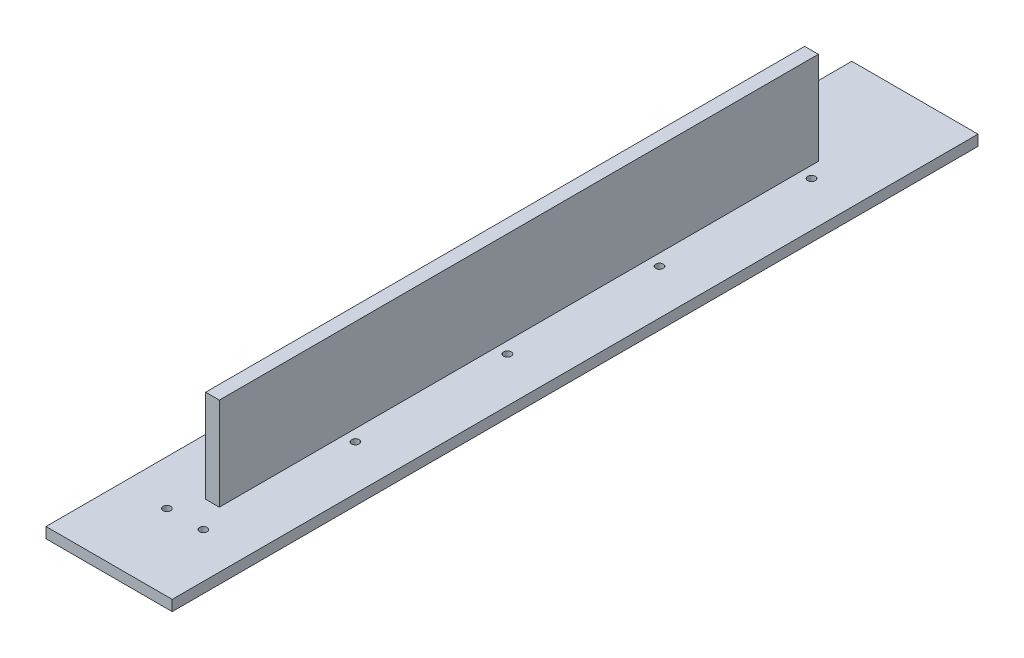
ISO-10303-21;
HEADER;
FILE_DESCRIPTION(('STEP AP214'),'2;1');
FILE_NAME('part.step','',(''),(''),'','','');
FILE_SCHEMA(('AUTOMOTIVE_DESIGN { 1 0 10303 214 1 1 1 1 }'));
ENDSEC;
DATA;
#1=APPLICATION_CONTEXT('core data for automotive mechanical design processes');
#2=APPLICATION_PROTOCOL_DEFINITION('international standard','automotive_design',2000,#1);
#3=PRODUCT_CONTEXT('',#1,'mechanical');
#4=PRODUCT('Part','Part','',(#3));
#5=PRODUCT_RELATED_PRODUCT_CATEGORY('part','',(#4));
#6=PRODUCT_DEFINITION_FORMATION('','',#4);
#7=PRODUCT_DEFINITION_CONTEXT('part definition',#1,'design');
#8=PRODUCT_DEFINITION('design','',#6,#7);
#9=PRODUCT_DEFINITION_SHAPE('','',#8);
#10=(LENGTH_UNIT() NAMED_UNIT(*) SI_UNIT(.MILLI.,.METRE.));
#11=(NAMED_UNIT(*) PLANE_ANGLE_UNIT() SI_UNIT($,.RADIAN.));
#12=(NAMED_UNIT(*) SI_UNIT($,.STERADIAN.) SOLID_ANGLE_UNIT());
#13=UNCERTAINTY_MEASURE_WITH_UNIT(LENGTH_MEASURE(1.E-05),#10,'distance_accuracy_value','');
#14=(GEOMETRIC_REPRESENTATION_CONTEXT(3) GLOBAL_UNCERTAINTY_ASSIGNED_CONTEXT((#13)) GLOBAL_UNIT_ASSIGNED_CONTEXT((#10,
#11,#12)) REPRESENTATION_CONTEXT('',''));
#15=CARTESIAN_POINT('',(0.,0.,0.));
#16=DIRECTION('',(0.,0.,1.));
#17=DIRECTION('',(1.,0.,0.));
#18=AXIS2_PLACEMENT_3D('',#15,#16,#17);
#19=CARTESIAN_POINT('',(0.,7.,530.));
#20=DIRECTION('',(1.,0.,0.));
#21=DIRECTION('',(0.,0.,-1.));
#22=AXIS2_PLACEMENT_3D('',#19,#20,#21);
#23=PLANE('',#22);
#24=DIRECTION('',(0.,-1.,0.));
#25=VECTOR('',#24,1.);
#26=CARTESIAN_POINT('',(0.,7.,0.));
#27=LINE('',#26,#25);
#28=CARTESIAN_POINT('',(0.,7.,0.));
#29=VERTEX_POINT('',#28);
#30=CARTESIAN_POINT('',(0.,0.,0.));
#31=VERTEX_POINT('',#30);
#32=EDGE_CURVE('E149',#29,#31,#27,.T.);
#33=ORIENTED_EDGE('',*,*,#32,.T.);
#34=DIRECTION('',(0.,0.,-1.));
#35=VECTOR('',#34,1.);
#36=CARTESIAN_POINT('',(0.,0.,530.));
#37=LINE('',#36,#35);
#38=CARTESIAN_POINT('',(0.,0.,530.));
#39=VERTEX_POINT('',#38);
#40=EDGE_CURVE('E11',#39,#31,#37,.T.);
#41=ORIENTED_EDGE('',*,*,#40,.F.);
#42=DIRECTION('',(0.,-1.,0.));
#43=VECTOR('',#42,1.);
#44=CARTESIAN_POINT('',(0.,7.,530.));
#45=LINE('',#44,#43);
#46=CARTESIAN_POINT('',(0.,7.,530.));
#47=VERTEX_POINT('',#46);
#48=EDGE_CURVE('E147',#47,#39,#45,.T.);
#49=ORIENTED_EDGE('',*,*,#48,.F.);
#50=DIRECTION('',(0.,0.,-1.));
#51=VECTOR('',#50,1.);
#52=CARTESIAN_POINT('',(0.,7.,530.));
#53=LINE('',#52,#51);
#54=EDGE_CURVE('E153',#47,#29,#53,.T.);
#55=ORIENTED_EDGE('',*,*,#54,.T.);
#56=EDGE_LOOP('',(#33,#41,#49,#55));
#57=FACE_BOUND('',#56,.T.);
#58=ADVANCED_FACE('F34',(#57),#23,.F.);
#59=CARTESIAN_POINT('',(0.,0.,530.));
#60=DIRECTION('',(0.,1.,0.));
#61=DIRECTION('',(0.,0.,1.));
#62=AXIS2_PLACEMENT_3D('',#59,#60,#61);
#63=PLANE('',#62);
#64=CARTESIAN_POINT('',(53.4999999999999,0.,480.));
#65=DIRECTION('',(0.,-1.,0.));
#66=DIRECTION('',(0.,0.,1.));
#67=AXIS2_PLACEMENT_3D('',#64,#65,#66);
#68=CIRCLE('',#67,2.5);
#69=CARTESIAN_POINT('',(53.4999999999999,0.,482.5));
#70=VERTEX_POINT('',#69);
#71=EDGE_CURVE('E368',#70,#70,#68,.T.);
#72=ORIENTED_EDGE('',*,*,#71,.F.);
#73=EDGE_LOOP('',(#72));
#74=FACE_BOUND('',#73,.T.);
#75=CARTESIAN_POINT('',(29.4999999999999,0.,480.));
#76=DIRECTION('',(0.,-1.,0.));
#77=DIRECTION('',(0.,0.,-1.));
#78=AXIS2_PLACEMENT_3D('',#75,#76,#77);
#79=CIRCLE('',#78,2.50000000000001);
#80=CARTESIAN_POINT('',(29.4999999999999,0.,477.5));
#81=VERTEX_POINT('',#80);
#82=EDGE_CURVE('E370',#81,#81,#79,.T.);
#83=ORIENTED_EDGE('',*,*,#82,.F.);
#84=EDGE_LOOP('',(#83));
#85=FACE_BOUND('',#84,.T.);
#86=CARTESIAN_POINT('',(53.4999999999999,0.,380.));
#87=DIRECTION('',(0.,-1.,0.));
#88=DIRECTION('',(0.,0.,1.));
#89=AXIS2_PLACEMENT_3D('',#86,#87,#88);
#90=CIRCLE('',#89,2.5);
#91=CARTESIAN_POINT('',(53.4999999999999,0.,382.5));
#92=VERTEX_POINT('',#91);
#93=EDGE_CURVE('E376',#92,#92,#90,.T.);
#94=ORIENTED_EDGE('',*,*,#93,.F.);
#95=EDGE_LOOP('',(#94));
#96=FACE_BOUND('',#95,.T.);
#97=CARTESIAN_POINT('',(29.4999999999999,0.,380.));
#98=DIRECTION('',(0.,-1.,0.));
#99=DIRECTION('',(0.,0.,-1.));
#100=AXIS2_PLACEMENT_3D('',#97,#98,#99);
#101=CIRCLE('',#100,2.5);
#102=CARTESIAN_POINT('',(29.4999999999999,0.,377.5));
#103=VERTEX_POINT('',#102);
#104=EDGE_CURVE('E382',#103,#103,#101,.T.);
#105=ORIENTED_EDGE('',*,*,#104,.F.);
#106=EDGE_LOOP('',(#105));
#107=FACE_BOUND('',#106,.T.);
#108=CARTESIAN_POINT('',(53.5,0.,280.));
#109=DIRECTION('',(0.,-1.,0.));
#110=DIRECTION('',(0.,0.,1.));
#111=AXIS2_PLACEMENT_3D('',#108,#109,#110);
#112=CIRCLE('',#111,2.5);
#113=CARTESIAN_POINT('',(53.5,0.,282.5));
#114=VERTEX_POINT('',#113);
#115=EDGE_CURVE('E388',#114,#114,#112,.T.);
#116=ORIENTED_EDGE('',*,*,#115,.F.);
#117=EDGE_LOOP('',(#116));
#118=FACE_BOUND('',#117,.T.);
#119=CARTESIAN_POINT('',(29.5,0.,280.));
#120=DIRECTION('',(0.,-1.,0.));
#121=DIRECTION('',(0.,0.,-1.));
#122=AXIS2_PLACEMENT_3D('',#119,#120,#121);
#123=CIRCLE('',#122,2.50000000000001);
#124=CARTESIAN_POINT('',(29.5,0.,277.5));
#125=VERTEX_POINT('',#124);
#126=EDGE_CURVE('E394',#125,#125,#123,.T.);
#127=ORIENTED_EDGE('',*,*,#126,.F.);
#128=EDGE_LOOP('',(#127));
#129=FACE_BOUND('',#128,.T.);
#130=CARTESIAN_POINT('',(53.5,0.,180.));
#131=DIRECTION('',(0.,-1.,0.));
#132=DIRECTION('',(0.,0.,1.));
#133=AXIS2_PLACEMENT_3D('',#130,#131,#132);
#134=CIRCLE('',#133,2.5);
#135=CARTESIAN_POINT('',(53.5,0.,182.5));
#136=VERTEX_POINT('',#135);
#137=EDGE_CURVE('E400',#136,#136,#134,.T.);
#138=ORIENTED_EDGE('',*,*,#137,.F.);
#139=EDGE_LOOP('',(#138));
#140=FACE_BOUND('',#139,.T.);
#141=CARTESIAN_POINT('',(29.5,0.,180.));
#142=DIRECTION('',(0.,-1.,0.));
#143=DIRECTION('',(0.,0.,-1.));
#144=AXIS2_PLACEMENT_3D('',#141,#142,#143);
#145=CIRCLE('',#144,2.50000000000001);
#146=CARTESIAN_POINT('',(29.5,0.,177.5));
#147=VERTEX_POINT('',#146);
#148=EDGE_CURVE('E406',#147,#147,#145,.T.);
#149=ORIENTED_EDGE('',*,*,#148,.F.);
#150=EDGE_LOOP('',(#149));
#151=FACE_BOUND('',#150,.T.);
#152=CARTESIAN_POINT('',(53.5,0.,80.));
#153=DIRECTION('',(0.,-1.,0.));
#154=DIRECTION('',(0.,0.,1.));
#155=AXIS2_PLACEMENT_3D('',#152,#153,#154);
#156=CIRCLE('',#155,2.5);
#157=CARTESIAN_POINT('',(53.5,0.,82.5));
#158=VERTEX_POINT('',#157);
#159=EDGE_CURVE('E412',#158,#158,#156,.T.);
#160=ORIENTED_EDGE('',*,*,#159,.F.);
#161=EDGE_LOOP('',(#160));
#162=FACE_BOUND('',#161,.T.);
#163=CARTESIAN_POINT('',(29.5,0.,80.));
#164=DIRECTION('',(0.,-1.,0.));
#165=DIRECTION('',(0.,0.,-1.));
#166=AXIS2_PLACEMENT_3D('',#163,#164,#165);
#167=CIRCLE('',#166,2.50000000000001);
#168=CARTESIAN_POINT('',(29.5,0.,77.5));
#169=VERTEX_POINT('',#168);
#170=EDGE_CURVE('E418',#169,#169,#167,.T.);
#171=ORIENTED_EDGE('',*,*,#170,.F.);
#172=EDGE_LOOP('',(#171));
#173=FACE_BOUND('',#172,.T.);
#174=DIRECTION('',(1.,0.,0.));
#175=VECTOR('',#174,1.);
#176=CARTESIAN_POINT('',(0.,0.,0.));
#177=LINE('',#176,#175);
#178=CARTESIAN_POINT('',(83.,0.,0.));
#179=VERTEX_POINT('',#178);
#180=EDGE_CURVE('E145',#31,#179,#177,.T.);
#181=ORIENTED_EDGE('',*,*,#180,.T.);
#182=DIRECTION('',(0.,0.,-1.));
#183=VECTOR('',#182,1.);
#184=CARTESIAN_POINT('',(83.,0.,530.));
#185=LINE('',#184,#183);
#186=CARTESIAN_POINT('',(83.,0.,530.));
#187=VERTEX_POINT('',#186);
#188=EDGE_CURVE('E42',#187,#179,#185,.T.);
#189=ORIENTED_EDGE('',*,*,#188,.F.);
#190=DIRECTION('',(1.,0.,0.));
#191=VECTOR('',#190,1.);
#192=CARTESIAN_POINT('',(0.,0.,530.));
#193=LINE('',#192,#191);
#194=EDGE_CURVE('E79',#39,#187,#193,.T.);
#195=ORIENTED_EDGE('',*,*,#194,.F.);
#196=ORIENTED_EDGE('',*,*,#40,.T.);
#197=EDGE_LOOP('',(#181,#189,#195,#196));
#198=FACE_BOUND('',#197,.T.);
#199=ADVANCED_FACE('F195',(#74,#85,#96,#107,#118,#129,#140,#151,#162,#173,#198),#63,.F.);
#200=CARTESIAN_POINT('',(83.,0.,530.));
#201=DIRECTION('',(-1.,0.,0.));
#202=DIRECTION('',(0.,0.,1.));
#203=AXIS2_PLACEMENT_3D('',#200,#201,#202);
#204=PLANE('',#203);
#205=DIRECTION('',(0.,1.,0.));
#206=VECTOR('',#205,1.);
#207=CARTESIAN_POINT('',(83.,0.,0.));
#208=LINE('',#207,#206);
#209=CARTESIAN_POINT('',(83.,7.,0.));
#210=VERTEX_POINT('',#209);
#211=EDGE_CURVE('E142',#179,#210,#208,.T.);
#212=ORIENTED_EDGE('',*,*,#211,.T.);
#213=DIRECTION('',(0.,0.,-1.));
#214=VECTOR('',#213,1.);
#215=CARTESIAN_POINT('',(83.,7.,530.));
#216=LINE('',#215,#214);
#217=CARTESIAN_POINT('',(83.,7.,530.));
#218=VERTEX_POINT('',#217);
#219=EDGE_CURVE('E131',#218,#210,#216,.T.);
#220=ORIENTED_EDGE('',*,*,#219,.F.);
#221=DIRECTION('',(0.,1.,0.));
#222=VECTOR('',#221,1.);
#223=CARTESIAN_POINT('',(83.,0.,530.));
#224=LINE('',#223,#222);
#225=EDGE_CURVE('E143',#187,#218,#224,.T.);
#226=ORIENTED_EDGE('',*,*,#225,.F.);
#227=ORIENTED_EDGE('',*,*,#188,.T.);
#228=EDGE_LOOP('',(#212,#220,#226,#227));
#229=FACE_BOUND('',#228,.T.);
#230=ADVANCED_FACE('F140',(#229),#204,.F.);
#231=CARTESIAN_POINT('',(46.,7.,530.));
#232=DIRECTION('',(-1.,0.,0.));
#233=DIRECTION('',(0.,0.,1.));
#234=AXIS2_PLACEMENT_3D('',#231,#232,#233);
#235=PLANE('',#234);
#236=DIRECTION('',(0.,0.,-1.));
#237=VECTOR('',#236,1.);
#238=CARTESIAN_POINT('',(46.,68.,530.));
#239=LINE('',#238,#237);
#240=CARTESIAN_POINT('',(46.,68.,462.));
#241=VERTEX_POINT('',#240);
#242=CARTESIAN_POINT('',(46.,68.,68.));
#243=VERTEX_POINT('',#242);
#244=EDGE_CURVE('E121',#241,#243,#239,.T.);
#245=ORIENTED_EDGE('',*,*,#244,.F.);
#246=DIRECTION('',(0.,-1.,0.));
#247=VECTOR('',#246,1.);
#248=CARTESIAN_POINT('',(46.,68.,462.));
#249=LINE('',#248,#247);
#250=CARTESIAN_POINT('',(46.,6.99999999999999,462.));
#251=VERTEX_POINT('',#250);
#252=EDGE_CURVE('E105',#241,#251,#249,.T.);
#253=ORIENTED_EDGE('',*,*,#252,.T.);
#254=DIRECTION('',(0.,0.,-1.));
#255=VECTOR('',#254,1.);
#256=CARTESIAN_POINT('',(46.,7.,530.));
#257=LINE('',#256,#255);
#258=CARTESIAN_POINT('',(46.,7.,68.));
#259=VERTEX_POINT('',#258);
#260=EDGE_CURVE('E129',#251,#259,#257,.T.);
#261=ORIENTED_EDGE('',*,*,#260,.T.);
#262=DIRECTION('',(0.,1.,0.));
#263=VECTOR('',#262,1.);
#264=CARTESIAN_POINT('',(46.,68.,68.));
#265=LINE('',#264,#263);
#266=EDGE_CURVE('E128',#259,#243,#265,.T.);
#267=ORIENTED_EDGE('',*,*,#266,.T.);
#268=EDGE_LOOP('',(#245,#253,#261,#267));
#269=FACE_BOUND('',#268,.T.);
#270=ADVANCED_FACE('F126',(#269),#235,.F.);
#271=CARTESIAN_POINT('',(46.,68.,530.));
#272=DIRECTION('',(0.,-1.,0.));
#273=DIRECTION('',(0.,0.,-1.));
#274=AXIS2_PLACEMENT_3D('',#271,#272,#273);
#275=PLANE('',#274);
#276=DIRECTION('',(0.,0.,-1.));
#277=VECTOR('',#276,1.);
#278=CARTESIAN_POINT('',(37.,68.,530.));
#279=LINE('',#278,#277);
#280=CARTESIAN_POINT('',(37.,68.,462.));
#281=VERTEX_POINT('',#280);
#282=CARTESIAN_POINT('',(37.,68.,68.));
#283=VERTEX_POINT('',#282);
#284=EDGE_CURVE('E123',#281,#283,#279,.T.);
#285=ORIENTED_EDGE('',*,*,#284,.F.);
#286=DIRECTION('',(-1.,0.,0.));
#287=VECTOR('',#286,1.);
#288=CARTESIAN_POINT('',(46.,68.,462.));
#289=LINE('',#288,#287);
#290=EDGE_CURVE('E109',#241,#281,#289,.T.);
#291=ORIENTED_EDGE('',*,*,#290,.F.);
#292=ORIENTED_EDGE('',*,*,#244,.T.);
#293=DIRECTION('',(-1.,0.,0.));
#294=VECTOR('',#293,1.);
#295=CARTESIAN_POINT('',(46.,68.,68.));
#296=LINE('',#295,#294);
#297=EDGE_CURVE('E166',#243,#283,#296,.T.);
#298=ORIENTED_EDGE('',*,*,#297,.T.);
#299=EDGE_LOOP('',(#285,#291,#292,#298));
#300=FACE_BOUND('',#299,.T.);
#301=ADVANCED_FACE('F119',(#300),#275,.F.);
#302=CARTESIAN_POINT('',(37.,68.,530.));
#303=DIRECTION('',(1.,0.,0.));
#304=DIRECTION('',(0.,0.,-1.));
#305=AXIS2_PLACEMENT_3D('',#302,#303,#304);
#306=PLANE('',#305);
#307=DIRECTION('',(0.,0.,-1.));
#308=VECTOR('',#307,1.);
#309=CARTESIAN_POINT('',(37.,7.,530.));
#310=LINE('',#309,#308);
#311=CARTESIAN_POINT('',(37.,6.99999999999999,462.));
#312=VERTEX_POINT('',#311);
#313=CARTESIAN_POINT('',(37.,7.,68.));
#314=VERTEX_POINT('',#313);
#315=EDGE_CURVE('E133',#312,#314,#310,.T.);
#316=ORIENTED_EDGE('',*,*,#315,.F.);
#317=DIRECTION('',(0.,-1.,0.));
#318=VECTOR('',#317,1.);
#319=CARTESIAN_POINT('',(37.,68.,462.));
#320=LINE('',#319,#318);
#321=EDGE_CURVE('E115',#281,#312,#320,.T.);
#322=ORIENTED_EDGE('',*,*,#321,.F.);
#323=ORIENTED_EDGE('',*,*,#284,.T.);
#324=DIRECTION('',(0.,1.,0.));
#325=VECTOR('',#324,1.);
#326=CARTESIAN_POINT('',(37.,68.,68.));
#327=LINE('',#326,#325);
#328=EDGE_CURVE('E165',#314,#283,#327,.T.);
#329=ORIENTED_EDGE('',*,*,#328,.F.);
#330=EDGE_LOOP('',(#316,#322,#323,#329));
#331=FACE_BOUND('',#330,.T.);
#332=ADVANCED_FACE('F168',(#331),#306,.F.);
#333=CARTESIAN_POINT('',(37.,7.,530.));
#334=DIRECTION('',(0.,-1.,0.));
#335=DIRECTION('',(1.,0.,0.));
#336=AXIS2_PLACEMENT_3D('',#333,#334,#335);
#337=PLANE('',#336);
#338=CARTESIAN_POINT('',(53.4999999999999,7.,480.));
#339=DIRECTION('',(0.,-1.,0.));
#340=DIRECTION('',(0.,0.,1.));
#341=AXIS2_PLACEMENT_3D('',#338,#339,#340);
#342=CIRCLE('',#341,2.5);
#343=CARTESIAN_POINT('',(53.4999999999999,7.,482.5));
#344=VERTEX_POINT('',#343);
#345=EDGE_CURVE('E366',#344,#344,#342,.T.);
#346=ORIENTED_EDGE('',*,*,#345,.T.);
#347=EDGE_LOOP('',(#346));
#348=FACE_BOUND('',#347,.T.);
#349=CARTESIAN_POINT('',(29.4999999999999,7.,480.));
#350=DIRECTION('',(0.,-1.,0.));
#351=DIRECTION('',(0.,0.,-1.));
#352=AXIS2_PLACEMENT_3D('',#349,#350,#351);
#353=CIRCLE('',#352,2.50000000000001);
#354=CARTESIAN_POINT('',(29.4999999999999,7.,477.5));
#355=VERTEX_POINT('',#354);
#356=EDGE_CURVE('E373',#355,#355,#353,.T.);
#357=ORIENTED_EDGE('',*,*,#356,.T.);
#358=EDGE_LOOP('',(#357));
#359=FACE_BOUND('',#358,.T.);
#360=CARTESIAN_POINT('',(53.4999999999999,7.,380.));
#361=DIRECTION('',(0.,-1.,0.));
#362=DIRECTION('',(0.,0.,1.));
#363=AXIS2_PLACEMENT_3D('',#360,#361,#362);
#364=CIRCLE('',#363,2.5);
#365=CARTESIAN_POINT('',(53.4999999999999,7.,382.5));
#366=VERTEX_POINT('',#365);
#367=EDGE_CURVE('E379',#366,#366,#364,.T.);
#368=ORIENTED_EDGE('',*,*,#367,.T.);
#369=EDGE_LOOP('',(#368));
#370=FACE_BOUND('',#369,.T.);
#371=CARTESIAN_POINT('',(29.4999999999999,7.,380.));
#372=DIRECTION('',(0.,-1.,0.));
#373=DIRECTION('',(0.,0.,-1.));
#374=AXIS2_PLACEMENT_3D('',#371,#372,#373);
#375=CIRCLE('',#374,2.5);
#376=CARTESIAN_POINT('',(29.4999999999999,7.,377.5));
#377=VERTEX_POINT('',#376);
#378=EDGE_CURVE('E385',#377,#377,#375,.T.);
#379=ORIENTED_EDGE('',*,*,#378,.T.);
#380=EDGE_LOOP('',(#379));
#381=FACE_BOUND('',#380,.T.);
#382=CARTESIAN_POINT('',(53.5,7.,280.));
#383=DIRECTION('',(0.,-1.,0.));
#384=DIRECTION('',(0.,0.,1.));
#385=AXIS2_PLACEMENT_3D('',#382,#383,#384);
#386=CIRCLE('',#385,2.5);
#387=CARTESIAN_POINT('',(53.5,7.,282.5));
#388=VERTEX_POINT('',#387);
#389=EDGE_CURVE('E391',#388,#388,#386,.T.);
#390=ORIENTED_EDGE('',*,*,#389,.T.);
#391=EDGE_LOOP('',(#390));
#392=FACE_BOUND('',#391,.T.);
#393=CARTESIAN_POINT('',(29.5,7.,280.));
#394=DIRECTION('',(0.,-1.,0.));
#395=DIRECTION('',(0.,0.,-1.));
#396=AXIS2_PLACEMENT_3D('',#393,#394,#395);
#397=CIRCLE('',#396,2.50000000000001);
#398=CARTESIAN_POINT('',(29.5,7.,277.5));
#399=VERTEX_POINT('',#398);
#400=EDGE_CURVE('E397',#399,#399,#397,.T.);
#401=ORIENTED_EDGE('',*,*,#400,.T.);
#402=EDGE_LOOP('',(#401));
#403=FACE_BOUND('',#402,.T.);
#404=CARTESIAN_POINT('',(53.5,7.,180.));
#405=DIRECTION('',(0.,-1.,0.));
#406=DIRECTION('',(0.,0.,1.));
#407=AXIS2_PLACEMENT_3D('',#404,#405,#406);
#408=CIRCLE('',#407,2.5);
#409=CARTESIAN_POINT('',(53.5,7.,182.5));
#410=VERTEX_POINT('',#409);
#411=EDGE_CURVE('E403',#410,#410,#408,.T.);
#412=ORIENTED_EDGE('',*,*,#411,.T.);
#413=EDGE_LOOP('',(#412));
#414=FACE_BOUND('',#413,.T.);
#415=CARTESIAN_POINT('',(29.5,7.,180.));
#416=DIRECTION('',(0.,-1.,0.));
#417=DIRECTION('',(0.,0.,-1.));
#418=AXIS2_PLACEMENT_3D('',#415,#416,#417);
#419=CIRCLE('',#418,2.50000000000001);
#420=CARTESIAN_POINT('',(29.5,7.,177.5));
#421=VERTEX_POINT('',#420);
#422=EDGE_CURVE('E409',#421,#421,#419,.T.);
#423=ORIENTED_EDGE('',*,*,#422,.T.);
#424=EDGE_LOOP('',(#423));
#425=FACE_BOUND('',#424,.T.);
#426=CARTESIAN_POINT('',(53.5,7.,80.));
#427=DIRECTION('',(0.,-1.,0.));
#428=DIRECTION('',(0.,0.,1.));
#429=AXIS2_PLACEMENT_3D('',#426,#427,#428);
#430=CIRCLE('',#429,2.5);
#431=CARTESIAN_POINT('',(53.5,7.,82.5));
#432=VERTEX_POINT('',#431);
#433=EDGE_CURVE('E415',#432,#432,#430,.T.);
#434=ORIENTED_EDGE('',*,*,#433,.T.);
#435=EDGE_LOOP('',(#434));
#436=FACE_BOUND('',#435,.T.);
#437=CARTESIAN_POINT('',(29.5,7.,80.));
#438=DIRECTION('',(0.,-1.,0.));
#439=DIRECTION('',(0.,0.,-1.));
#440=AXIS2_PLACEMENT_3D('',#437,#438,#439);
#441=CIRCLE('',#440,2.50000000000001);
#442=CARTESIAN_POINT('',(29.5,7.,77.5));
#443=VERTEX_POINT('',#442);
#444=EDGE_CURVE('E421',#443,#443,#441,.T.);
#445=ORIENTED_EDGE('',*,*,#444,.T.);
#446=EDGE_LOOP('',(#445));
#447=FACE_BOUND('',#446,.T.);
#448=ORIENTED_EDGE('',*,*,#260,.F.);
#449=DIRECTION('',(-1.,0.,0.));
#450=VECTOR('',#449,1.);
#451=CARTESIAN_POINT('',(46.,6.99999999999999,462.));
#452=LINE('',#451,#450);
#453=EDGE_CURVE('E111',#251,#312,#452,.T.);
#454=ORIENTED_EDGE('',*,*,#453,.T.);
#455=ORIENTED_EDGE('',*,*,#315,.T.);
#456=DIRECTION('',(-1.,0.,0.));
#457=VECTOR('',#456,1.);
#458=CARTESIAN_POINT('',(46.,7.,68.));
#459=LINE('',#458,#457);
#460=EDGE_CURVE('E159',#259,#314,#459,.T.);
#461=ORIENTED_EDGE('',*,*,#460,.F.);
#462=EDGE_LOOP('',(#448,#454,#455,#461));
#463=FACE_BOUND('',#462,.T.);
#464=DIRECTION('',(-1.,0.,0.));
#465=VECTOR('',#464,1.);
#466=CARTESIAN_POINT('',(37.,7.,0.));
#467=LINE('',#466,#465);
#468=EDGE_CURVE('E68',#210,#29,#467,.T.);
#469=ORIENTED_EDGE('',*,*,#468,.T.);
#470=ORIENTED_EDGE('',*,*,#54,.F.);
#471=DIRECTION('',(-1.,0.,0.));
#472=VECTOR('',#471,1.);
#473=CARTESIAN_POINT('',(83.,7.,530.));
#474=LINE('',#473,#472);
#475=EDGE_CURVE('E50',#218,#47,#474,.T.);
#476=ORIENTED_EDGE('',*,*,#475,.F.);
#477=ORIENTED_EDGE('',*,*,#219,.T.);
#478=EDGE_LOOP('',(#469,#470,#476,#477));
#479=FACE_BOUND('',#478,.T.);
#480=ADVANCED_FACE('F158',(#348,#359,#370,#381,#392,#403,#414,#425,#436,#447,#463,#479),#337,.F.);
#481=CARTESIAN_POINT('',(0.,0.,530.));
#482=DIRECTION('',(0.,0.,1.));
#483=DIRECTION('',(1.,0.,0.));
#484=AXIS2_PLACEMENT_3D('',#481,#482,#483);
#485=PLANE('',#484);
#486=ORIENTED_EDGE('',*,*,#475,.T.);
#487=ORIENTED_EDGE('',*,*,#48,.T.);
#488=ORIENTED_EDGE('',*,*,#194,.T.);
#489=ORIENTED_EDGE('',*,*,#225,.T.);
#490=EDGE_LOOP('',(#486,#487,#488,#489));
#491=FACE_BOUND('',#490,.T.);
#492=ADVANCED_FACE('F182',(#491),#485,.T.);
#493=CARTESIAN_POINT('',(0.,0.,0.));
#494=DIRECTION('',(0.,0.,1.));
#495=DIRECTION('',(1.,0.,0.));
#496=AXIS2_PLACEMENT_3D('',#493,#494,#495);
#497=PLANE('',#496);
#498=ORIENTED_EDGE('',*,*,#468,.F.);
#499=ORIENTED_EDGE('',*,*,#211,.F.);
#500=ORIENTED_EDGE('',*,*,#180,.F.);
#501=ORIENTED_EDGE('',*,*,#32,.F.);
#502=EDGE_LOOP('',(#498,#499,#500,#501));
#503=FACE_BOUND('',#502,.T.);
#504=ADVANCED_FACE('F144',(#503),#497,.F.);
#505=CARTESIAN_POINT('',(46.,68.,68.));
#506=DIRECTION('',(0.,0.,1.));
#507=DIRECTION('',(1.,0.,0.));
#508=AXIS2_PLACEMENT_3D('',#505,#506,#507);
#509=PLANE('',#508);
#510=ORIENTED_EDGE('',*,*,#328,.T.);
#511=ORIENTED_EDGE('',*,*,#297,.F.);
#512=ORIENTED_EDGE('',*,*,#266,.F.);
#513=ORIENTED_EDGE('',*,*,#460,.T.);
#514=EDGE_LOOP('',(#510,#511,#512,#513));
#515=FACE_BOUND('',#514,.T.);
#516=ADVANCED_FACE('F164',(#515),#509,.F.);
#517=CARTESIAN_POINT('',(46.,68.,462.));
#518=DIRECTION('',(0.,0.,-1.));
#519=DIRECTION('',(-1.,0.,0.));
#520=AXIS2_PLACEMENT_3D('',#517,#518,#519);
#521=PLANE('',#520);
#522=ORIENTED_EDGE('',*,*,#321,.T.);
#523=ORIENTED_EDGE('',*,*,#453,.F.);
#524=ORIENTED_EDGE('',*,*,#252,.F.);
#525=ORIENTED_EDGE('',*,*,#290,.T.);
#526=EDGE_LOOP('',(#522,#523,#524,#525));
#527=FACE_BOUND('',#526,.T.);
#528=ADVANCED_FACE('F108',(#527),#521,.F.);
#529=CARTESIAN_POINT('',(29.5,7.,80.));
#530=DIRECTION('',(0.,-1.,0.));
#531=DIRECTION('',(0.,0.,-1.));
#532=AXIS2_PLACEMENT_3D('',#529,#530,#531);
#533=CYLINDRICAL_SURFACE('',#532,2.50000000000001);
#534=ORIENTED_EDGE('',*,*,#444,.F.);
#535=EDGE_LOOP('',(#534));
#536=FACE_BOUND('',#535,.T.);
#537=ORIENTED_EDGE('',*,*,#170,.T.);
#538=EDGE_LOOP('',(#537));
#539=FACE_BOUND('',#538,.T.);
#540=ADVANCED_FACE('F250',(#536,#539),#533,.F.);
#541=CARTESIAN_POINT('',(53.5,7.,80.));
#542=DIRECTION('',(0.,-1.,0.));
#543=DIRECTION('',(0.,0.,-1.));
#544=AXIS2_PLACEMENT_3D('',#541,#542,#543);
#545=CYLINDRICAL_SURFACE('',#544,2.5);
#546=ORIENTED_EDGE('',*,*,#433,.F.);
#547=EDGE_LOOP('',(#546));
#548=FACE_BOUND('',#547,.T.);
#549=ORIENTED_EDGE('',*,*,#159,.T.);
#550=EDGE_LOOP('',(#549));
#551=FACE_BOUND('',#550,.T.);
#552=ADVANCED_FACE('F270',(#548,#551),#545,.F.);
#553=CARTESIAN_POINT('',(29.5,7.,180.));
#554=DIRECTION('',(0.,-1.,0.));
#555=DIRECTION('',(0.,0.,-1.));
#556=AXIS2_PLACEMENT_3D('',#553,#554,#555);
#557=CYLINDRICAL_SURFACE('',#556,2.50000000000001);
#558=ORIENTED_EDGE('',*,*,#422,.F.);
#559=EDGE_LOOP('',(#558));
#560=FACE_BOUND('',#559,.T.);
#561=ORIENTED_EDGE('',*,*,#148,.T.);
#562=EDGE_LOOP('',(#561));
#563=FACE_BOUND('',#562,.T.);
#564=ADVANCED_FACE('F280',(#560,#563),#557,.F.);
#565=CARTESIAN_POINT('',(53.5,7.,180.));
#566=DIRECTION('',(0.,-1.,0.));
#567=DIRECTION('',(0.,0.,-1.));
#568=AXIS2_PLACEMENT_3D('',#565,#566,#567);
#569=CYLINDRICAL_SURFACE('',#568,2.5);
#570=ORIENTED_EDGE('',*,*,#411,.F.);
#571=EDGE_LOOP('',(#570));
#572=FACE_BOUND('',#571,.T.);
#573=ORIENTED_EDGE('',*,*,#137,.T.);
#574=EDGE_LOOP('',(#573));
#575=FACE_BOUND('',#574,.T.);
#576=ADVANCED_FACE('F290',(#572,#575),#569,.F.);
#577=CARTESIAN_POINT('',(29.5,7.,280.));
#578=DIRECTION('',(0.,-1.,0.));
#579=DIRECTION('',(0.,0.,-1.));
#580=AXIS2_PLACEMENT_3D('',#577,#578,#579);
#581=CYLINDRICAL_SURFACE('',#580,2.50000000000001);
#582=ORIENTED_EDGE('',*,*,#400,.F.);
#583=EDGE_LOOP('',(#582));
#584=FACE_BOUND('',#583,.T.);
#585=ORIENTED_EDGE('',*,*,#126,.T.);
#586=EDGE_LOOP('',(#585));
#587=FACE_BOUND('',#586,.T.);
#588=ADVANCED_FACE('F300',(#584,#587),#581,.F.);
#589=CARTESIAN_POINT('',(53.5,7.,280.));
#590=DIRECTION('',(0.,-1.,0.));
#591=DIRECTION('',(0.,0.,-1.));
#592=AXIS2_PLACEMENT_3D('',#589,#590,#591);
#593=CYLINDRICAL_SURFACE('',#592,2.5);
#594=ORIENTED_EDGE('',*,*,#389,.F.);
#595=EDGE_LOOP('',(#594));
#596=FACE_BOUND('',#595,.T.);
#597=ORIENTED_EDGE('',*,*,#115,.T.);
#598=EDGE_LOOP('',(#597));
#599=FACE_BOUND('',#598,.T.);
#600=ADVANCED_FACE('F310',(#596,#599),#593,.F.);
#601=CARTESIAN_POINT('',(29.4999999999999,7.,380.));
#602=DIRECTION('',(0.,-1.,0.));
#603=DIRECTION('',(0.,0.,-1.));
#604=AXIS2_PLACEMENT_3D('',#601,#602,#603);
#605=CYLINDRICAL_SURFACE('',#604,2.5);
#606=ORIENTED_EDGE('',*,*,#378,.F.);
#607=EDGE_LOOP('',(#606));
#608=FACE_BOUND('',#607,.T.);
#609=ORIENTED_EDGE('',*,*,#104,.T.);
#610=EDGE_LOOP('',(#609));
#611=FACE_BOUND('',#610,.T.);
#612=ADVANCED_FACE('F320',(#608,#611),#605,.F.);
#613=CARTESIAN_POINT('',(53.4999999999999,7.,380.));
#614=DIRECTION('',(0.,-1.,0.));
#615=DIRECTION('',(0.,0.,-1.));
#616=AXIS2_PLACEMENT_3D('',#613,#614,#615);
#617=CYLINDRICAL_SURFACE('',#616,2.5);
#618=ORIENTED_EDGE('',*,*,#367,.F.);
#619=EDGE_LOOP('',(#618));
#620=FACE_BOUND('',#619,.T.);
#621=ORIENTED_EDGE('',*,*,#93,.T.);
#622=EDGE_LOOP('',(#621));
#623=FACE_BOUND('',#622,.T.);
#624=ADVANCED_FACE('F330',(#620,#623),#617,.F.);
#625=CARTESIAN_POINT('',(29.4999999999999,7.,480.));
#626=DIRECTION('',(0.,-1.,0.));
#627=DIRECTION('',(0.,0.,-1.));
#628=AXIS2_PLACEMENT_3D('',#625,#626,#627);
#629=CYLINDRICAL_SURFACE('',#628,2.50000000000001);
#630=ORIENTED_EDGE('',*,*,#356,.F.);
#631=EDGE_LOOP('',(#630));
#632=FACE_BOUND('',#631,.T.);
#633=ORIENTED_EDGE('',*,*,#82,.T.);
#634=EDGE_LOOP('',(#633));
#635=FACE_BOUND('',#634,.T.);
#636=ADVANCED_FACE('F340',(#632,#635),#629,.F.);
#637=CARTESIAN_POINT('',(53.4999999999999,7.,480.));
#638=DIRECTION('',(0.,-1.,0.));
#639=DIRECTION('',(0.,0.,-1.));
#640=AXIS2_PLACEMENT_3D('',#637,#638,#639);
#641=CYLINDRICAL_SURFACE('',#640,2.5);
#642=ORIENTED_EDGE('',*,*,#345,.F.);
#643=EDGE_LOOP('',(#642));
#644=FACE_BOUND('',#643,.T.);
#645=ORIENTED_EDGE('',*,*,#71,.T.);
#646=EDGE_LOOP('',(#645));
#647=FACE_BOUND('',#646,.T.);
#648=ADVANCED_FACE('F350',(#644,#647),#641,.F.);
#649=CLOSED_SHELL('',(#58,#199,#230,#270,#301,#332,#480,#492,#504,#516,#528,#540,#552,#564,#576,
#588,#600,#612,#624,#636,#648));
#650=MANIFOLD_SOLID_BREP('B2',#649);
#651=ADVANCED_BREP_SHAPE_REPRESENTATION('',(#18,#650),#14);
#652=SHAPE_DEFINITION_REPRESENTATION(#9,#651);
ENDSEC;
END-ISO-10303-21;
